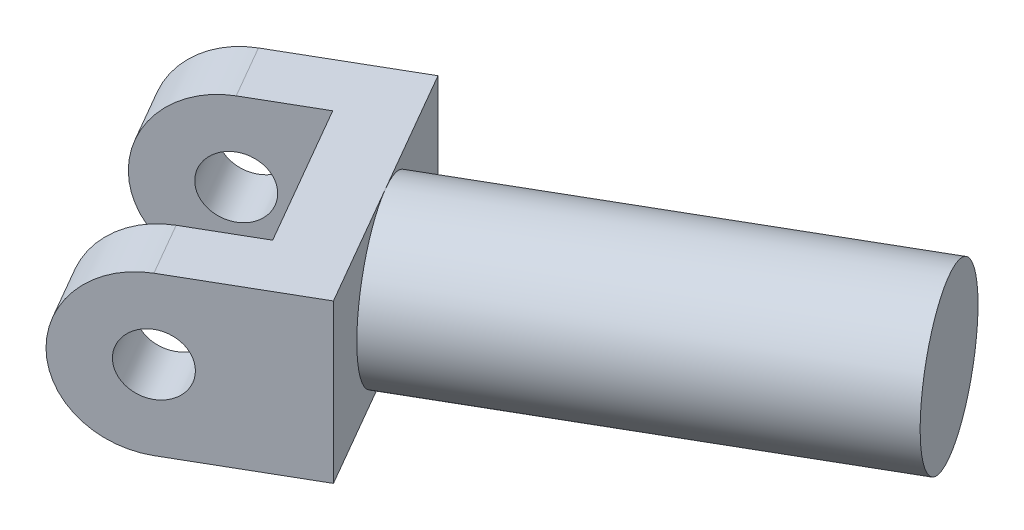
ISO-10303-21;
HEADER;
FILE_DESCRIPTION(('STEP AP214'),'2;1');
FILE_NAME('part.step','',(''),(''),'','','');
FILE_SCHEMA(('AUTOMOTIVE_DESIGN { 1 0 10303 214 1 1 1 1 }'));
ENDSEC;
DATA;
#1=APPLICATION_CONTEXT('core data for automotive mechanical design processes');
#2=APPLICATION_PROTOCOL_DEFINITION('international standard','automotive_design',2000,#1);
#3=PRODUCT_CONTEXT('',#1,'mechanical');
#4=PRODUCT('Part','Part','',(#3));
#5=PRODUCT_RELATED_PRODUCT_CATEGORY('part','',(#4));
#6=PRODUCT_DEFINITION_FORMATION('','',#4);
#7=PRODUCT_DEFINITION_CONTEXT('part definition',#1,'design');
#8=PRODUCT_DEFINITION('design','',#6,#7);
#9=PRODUCT_DEFINITION_SHAPE('','',#8);
#10=(LENGTH_UNIT() NAMED_UNIT(*) SI_UNIT(.MILLI.,.METRE.));
#11=(NAMED_UNIT(*) PLANE_ANGLE_UNIT() SI_UNIT($,.RADIAN.));
#12=(NAMED_UNIT(*) SI_UNIT($,.STERADIAN.) SOLID_ANGLE_UNIT());
#13=UNCERTAINTY_MEASURE_WITH_UNIT(LENGTH_MEASURE(1.E-05),#10,'distance_accuracy_value','');
#14=(GEOMETRIC_REPRESENTATION_CONTEXT(3) GLOBAL_UNCERTAINTY_ASSIGNED_CONTEXT((#13)) GLOBAL_UNIT_ASSIGNED_CONTEXT((#10,
#11,#12)) REPRESENTATION_CONTEXT('',''));
#15=CARTESIAN_POINT('',(0.,0.,0.));
#16=DIRECTION('',(0.,0.,1.));
#17=DIRECTION('',(1.,0.,0.));
#18=AXIS2_PLACEMENT_3D('',#15,#16,#17);
#19=CARTESIAN_POINT('',(-6.75000000000001,0.,-11.6913429510899));
#20=DIRECTION('',(-0.5,0.,-0.866025403784439));
#21=DIRECTION('',(0.866025403784439,0.,-0.5));
#22=AXIS2_PLACEMENT_3D('',#19,#20,#21);
#23=PLANE('',#22);
#24=CARTESIAN_POINT('',(-6.75000000000001,0.,-11.6913429510899));
#25=DIRECTION('',(-0.5,0.,-0.866025403784439));
#26=DIRECTION('',(0.866025403784439,0.,-0.5));
#27=AXIS2_PLACEMENT_3D('',#24,#25,#26);
#28=CIRCLE('',#27,5.);
#29=CARTESIAN_POINT('',(-2.41987298107782,0.,-14.1913429510899));
#30=VERTEX_POINT('',#29);
#31=EDGE_CURVE('E169',#30,#30,#28,.T.);
#32=ORIENTED_EDGE('',*,*,#31,.T.);
#33=EDGE_LOOP('',(#32));
#34=FACE_BOUND('',#33,.T.);
#35=DIRECTION('',(0.,-1.,0.));
#36=VECTOR('',#35,1.);
#37=CARTESIAN_POINT('',(3.31863148873325,0.,-17.5044700514812));
#38=LINE('',#37,#36);
#39=CARTESIAN_POINT('',(3.31863148873325,13.,-17.5044700514812));
#40=VERTEX_POINT('',#39);
#41=CARTESIAN_POINT('',(3.31863148873324,-13.,-17.5044700514812));
#42=VERTEX_POINT('',#41);
#43=EDGE_CURVE('E52',#40,#42,#38,.T.);
#44=ORIENTED_EDGE('',*,*,#43,.F.);
#45=DIRECTION('',(0.866025403784439,0.,-0.5));
#46=VECTOR('',#45,1.);
#47=CARTESIAN_POINT('',(-6.75000000000001,13.,-11.6913429510899));
#48=LINE('',#47,#46);
#49=CARTESIAN_POINT('',(-6.75000000000001,13.,-11.6913429510899));
#50=VERTEX_POINT('',#49);
#51=EDGE_CURVE('E185',#50,#40,#48,.T.);
#52=ORIENTED_EDGE('',*,*,#51,.F.);
#53=CARTESIAN_POINT('',(-6.75000000000001,0.,-11.6913429510899));
#54=DIRECTION('',(-0.5,0.,-0.866025403784439));
#55=DIRECTION('',(0.866025403784439,0.,-0.5));
#56=AXIS2_PLACEMENT_3D('',#53,#54,#55);
#57=CIRCLE('',#56,13.);
#58=CARTESIAN_POINT('',(-6.75000000000001,-13.,-11.6913429510899));
#59=VERTEX_POINT('',#58);
#60=EDGE_CURVE('E173',#59,#50,#57,.T.);
#61=ORIENTED_EDGE('',*,*,#60,.F.);
#62=DIRECTION('',(-0.866025403784439,0.,0.5));
#63=VECTOR('',#62,1.);
#64=CARTESIAN_POINT('',(-6.75000000000001,-13.,-11.6913429510899));
#65=LINE('',#64,#63);
#66=EDGE_CURVE('E74',#42,#59,#65,.T.);
#67=ORIENTED_EDGE('',*,*,#66,.F.);
#68=EDGE_LOOP('',(#44,#52,#61,#67));
#69=FACE_BOUND('',#68,.T.);
#70=ADVANCED_FACE('F37',(#34,#69),#23,.F.);
#71=CARTESIAN_POINT('',(-11.75,0.,-20.3515969889343));
#72=DIRECTION('',(-0.5,0.,-0.866025403784439));
#73=DIRECTION('',(0.866025403784439,0.,-0.5));
#74=AXIS2_PLACEMENT_3D('',#71,#72,#73);
#75=PLANE('',#74);
#76=DIRECTION('',(0.866025403784439,0.,-0.5));
#77=VECTOR('',#76,1.);
#78=CARTESIAN_POINT('',(-11.75,13.,-20.3515969889343));
#79=LINE('',#78,#77);
#80=CARTESIAN_POINT('',(-11.75,13.,-20.3515969889343));
#81=VERTEX_POINT('',#80);
#82=CARTESIAN_POINT('',(6.97888552657763,13.,-31.1647240893256));
#83=VERTEX_POINT('',#82);
#84=EDGE_CURVE('E81',#81,#83,#79,.T.);
#85=ORIENTED_EDGE('',*,*,#84,.T.);
#86=DIRECTION('',(0.,-1.,0.));
#87=VECTOR('',#86,1.);
#88=CARTESIAN_POINT('',(6.97888552657763,-13.,-31.1647240893256));
#89=LINE('',#88,#87);
#90=CARTESIAN_POINT('',(6.97888552657763,-13.,-31.1647240893256));
#91=VERTEX_POINT('',#90);
#92=EDGE_CURVE('E179',#83,#91,#89,.T.);
#93=ORIENTED_EDGE('',*,*,#92,.T.);
#94=DIRECTION('',(-0.866025403784439,0.,0.5));
#95=VECTOR('',#94,1.);
#96=CARTESIAN_POINT('',(-11.75,-13.,-20.3515969889343));
#97=LINE('',#96,#95);
#98=CARTESIAN_POINT('',(-11.75,-13.,-20.3515969889343));
#99=VERTEX_POINT('',#98);
#100=EDGE_CURVE('E61',#91,#99,#97,.T.);
#101=ORIENTED_EDGE('',*,*,#100,.T.);
#102=CARTESIAN_POINT('',(-11.75,0.,-20.3515969889343));
#103=DIRECTION('',(-0.5,0.,-0.866025403784439));
#104=DIRECTION('',(0.866025403784439,0.,-0.5));
#105=AXIS2_PLACEMENT_3D('',#102,#103,#104);
#106=CIRCLE('',#105,13.);
#107=EDGE_CURVE('E176',#99,#81,#106,.T.);
#108=ORIENTED_EDGE('',*,*,#107,.T.);
#109=EDGE_LOOP('',(#85,#93,#101,#108));
#110=FACE_BOUND('',#109,.T.);
#111=CARTESIAN_POINT('',(-11.75,0.,-20.3515969889343));
#112=DIRECTION('',(-0.5,0.,-0.866025403784439));
#113=DIRECTION('',(0.866025403784439,0.,-0.5));
#114=AXIS2_PLACEMENT_3D('',#111,#112,#113);
#115=CIRCLE('',#114,5.);
#116=CARTESIAN_POINT('',(-7.41987298107782,0.,-22.8515969889343));
#117=VERTEX_POINT('',#116);
#118=EDGE_CURVE('E170',#117,#117,#115,.T.);
#119=ORIENTED_EDGE('',*,*,#118,.F.);
#120=EDGE_LOOP('',(#119));
#121=FACE_BOUND('',#120,.T.);
#122=ADVANCED_FACE('F217',(#110,#121),#75,.T.);
#123=CARTESIAN_POINT('',(-11.75,0.,-20.3515969889343));
#124=DIRECTION('',(0.5,0.,0.866025403784439));
#125=DIRECTION('',(-0.866025403784439,0.,0.5));
#126=AXIS2_PLACEMENT_3D('',#123,#124,#125);
#127=CYLINDRICAL_SURFACE('',#126,13.);
#128=ORIENTED_EDGE('',*,*,#60,.T.);
#129=DIRECTION('',(0.5,0.,0.866025403784439));
#130=VECTOR('',#129,1.);
#131=CARTESIAN_POINT('',(-11.75,13.,-20.3515969889343));
#132=LINE('',#131,#130);
#133=EDGE_CURVE('E12',#81,#50,#132,.T.);
#134=ORIENTED_EDGE('',*,*,#133,.F.);
#135=ORIENTED_EDGE('',*,*,#107,.F.);
#136=DIRECTION('',(0.5,0.,0.866025403784439));
#137=VECTOR('',#136,1.);
#138=CARTESIAN_POINT('',(-11.75,-13.,-20.3515969889343));
#139=LINE('',#138,#137);
#140=EDGE_CURVE('E182',#99,#59,#139,.T.);
#141=ORIENTED_EDGE('',*,*,#140,.T.);
#142=EDGE_LOOP('',(#128,#134,#135,#141));
#143=FACE_BOUND('',#142,.T.);
#144=ADVANCED_FACE('F39',(#143),#127,.T.);
#145=CARTESIAN_POINT('',(-11.75,13.,-20.3515969889343));
#146=DIRECTION('',(0.,-1.,0.));
#147=DIRECTION('',(-0.5,0.,0.866025403784439));
#148=AXIS2_PLACEMENT_3D('',#145,#146,#147);
#149=PLANE('',#148);
#150=DIRECTION('',(0.5,0.,0.866025403784439));
#151=VECTOR('',#150,1.);
#152=CARTESIAN_POINT('',(6.97888552657763,13.,-31.1647240893256));
#153=LINE('',#152,#151);
#154=CARTESIAN_POINT('',(18.7288855265777,13.,-10.8131271003913));
#155=VERTEX_POINT('',#154);
#156=EDGE_CURVE('E45',#83,#155,#153,.T.);
#157=ORIENTED_EDGE('',*,*,#156,.F.);
#158=ORIENTED_EDGE('',*,*,#84,.F.);
#159=ORIENTED_EDGE('',*,*,#133,.T.);
#160=ORIENTED_EDGE('',*,*,#51,.T.);
#161=DIRECTION('',(0.5,0.,0.866025403784438));
#162=VECTOR('',#161,1.);
#163=CARTESIAN_POINT('',(21.8186314887333,13.,14.538469888543));
#164=LINE('',#163,#162);
#165=CARTESIAN_POINT('',(16.8186314887333,13.,5.87821585069863));
#166=VERTEX_POINT('',#165);
#167=EDGE_CURVE('E128',#40,#166,#164,.T.);
#168=ORIENTED_EDGE('',*,*,#167,.T.);
#169=DIRECTION('',(-0.866025403784438,0.,0.5));
#170=VECTOR('',#169,1.);
#171=CARTESIAN_POINT('',(6.75,13.,11.6913429510899));
#172=LINE('',#171,#170);
#173=CARTESIAN_POINT('',(6.75,13.,11.6913429510899));
#174=VERTEX_POINT('',#173);
#175=EDGE_CURVE('E139',#166,#174,#172,.T.);
#176=ORIENTED_EDGE('',*,*,#175,.T.);
#177=DIRECTION('',(-0.5,0.,-0.866025403784438));
#178=VECTOR('',#177,1.);
#179=CARTESIAN_POINT('',(11.75,13.,20.3515969889343));
#180=LINE('',#179,#178);
#181=CARTESIAN_POINT('',(11.75,13.,20.3515969889343));
#182=VERTEX_POINT('',#181);
#183=EDGE_CURVE('E138',#182,#174,#180,.T.);
#184=ORIENTED_EDGE('',*,*,#183,.F.);
#185=DIRECTION('',(0.866025403784438,0.,-0.5));
#186=VECTOR('',#185,1.);
#187=CARTESIAN_POINT('',(21.8186314887333,13.,14.538469888543));
#188=LINE('',#187,#186);
#189=CARTESIAN_POINT('',(30.4788855265776,13.,9.53846988854301));
#190=VERTEX_POINT('',#189);
#191=EDGE_CURVE('E127',#182,#190,#188,.T.);
#192=ORIENTED_EDGE('',*,*,#191,.T.);
#193=DIRECTION('',(0.5,0.,0.866025403784438));
#194=VECTOR('',#193,1.);
#195=CARTESIAN_POINT('',(30.4788855265776,13.,9.53846988854301));
#196=LINE('',#195,#194);
#197=EDGE_CURVE('E159',#155,#190,#196,.T.);
#198=ORIENTED_EDGE('',*,*,#197,.F.);
#199=EDGE_LOOP('',(#157,#158,#159,#160,#168,#176,#184,#192,#198));
#200=FACE_BOUND('',#199,.T.);
#201=ADVANCED_FACE('F197',(#200),#149,.F.);
#202=CARTESIAN_POINT('',(6.97888552657763,-13.,-31.1647240893256));
#203=DIRECTION('',(-0.866025403784439,0.,0.5));
#204=DIRECTION('',(-0.5,0.,-0.866025403784439));
#205=AXIS2_PLACEMENT_3D('',#202,#203,#204);
#206=PLANE('',#205);
#207=ORIENTED_EDGE('',*,*,#156,.T.);
#208=CARTESIAN_POINT('',(18.7288855265777,0.,-10.8131271003913));
#209=DIRECTION('',(0.866025403784438,0.,-0.5));
#210=DIRECTION('',(-0.5,0.,-0.866025403784439));
#211=AXIS2_PLACEMENT_3D('',#208,#209,#210);
#212=CIRCLE('',#211,13.);
#213=CARTESIAN_POINT('',(18.7288855265777,-13.,-10.8131271003913));
#214=VERTEX_POINT('',#213);
#215=EDGE_CURVE('E144',#214,#155,#212,.T.);
#216=ORIENTED_EDGE('',*,*,#215,.F.);
#217=DIRECTION('',(0.5,0.,0.866025403784439));
#218=VECTOR('',#217,1.);
#219=CARTESIAN_POINT('',(6.97888552657763,-13.,-31.1647240893256));
#220=LINE('',#219,#218);
#221=EDGE_CURVE('E189',#91,#214,#220,.T.);
#222=ORIENTED_EDGE('',*,*,#221,.F.);
#223=ORIENTED_EDGE('',*,*,#92,.F.);
#224=EDGE_LOOP('',(#207,#216,#222,#223));
#225=FACE_BOUND('',#224,.T.);
#226=ADVANCED_FACE('F194',(#225),#206,.F.);
#227=CARTESIAN_POINT('',(-11.75,-13.,-20.3515969889343));
#228=DIRECTION('',(0.,1.,0.));
#229=DIRECTION('',(0.5,0.,-0.866025403784439));
#230=AXIS2_PLACEMENT_3D('',#227,#228,#229);
#231=PLANE('',#230);
#232=ORIENTED_EDGE('',*,*,#221,.T.);
#233=DIRECTION('',(-0.5,0.,-0.866025403784438));
#234=VECTOR('',#233,1.);
#235=CARTESIAN_POINT('',(30.4788855265776,-13.,9.53846988854301));
#236=LINE('',#235,#234);
#237=CARTESIAN_POINT('',(30.4788855265776,-13.,9.53846988854301));
#238=VERTEX_POINT('',#237);
#239=EDGE_CURVE('E123',#238,#214,#236,.T.);
#240=ORIENTED_EDGE('',*,*,#239,.F.);
#241=DIRECTION('',(0.866025403784438,0.,-0.5));
#242=VECTOR('',#241,1.);
#243=CARTESIAN_POINT('',(21.8186314887333,-13.,14.538469888543));
#244=LINE('',#243,#242);
#245=CARTESIAN_POINT('',(11.75,-13.,20.3515969889343));
#246=VERTEX_POINT('',#245);
#247=EDGE_CURVE('E115',#246,#238,#244,.T.);
#248=ORIENTED_EDGE('',*,*,#247,.F.);
#249=DIRECTION('',(-0.5,0.,-0.866025403784438));
#250=VECTOR('',#249,1.);
#251=CARTESIAN_POINT('',(11.75,-13.,20.3515969889343));
#252=LINE('',#251,#250);
#253=CARTESIAN_POINT('',(6.75,-13.,11.6913429510899));
#254=VERTEX_POINT('',#253);
#255=EDGE_CURVE('E120',#246,#254,#252,.T.);
#256=ORIENTED_EDGE('',*,*,#255,.T.);
#257=DIRECTION('',(0.866025403784438,0.,-0.5));
#258=VECTOR('',#257,1.);
#259=CARTESIAN_POINT('',(6.75,-13.,11.6913429510899));
#260=LINE('',#259,#258);
#261=CARTESIAN_POINT('',(16.8186314887333,-13.,5.87821585069863));
#262=VERTEX_POINT('',#261);
#263=EDGE_CURVE('E246',#254,#262,#260,.T.);
#264=ORIENTED_EDGE('',*,*,#263,.T.);
#265=DIRECTION('',(-0.5,0.,-0.866025403784438));
#266=VECTOR('',#265,1.);
#267=CARTESIAN_POINT('',(21.8186314887333,-13.,14.538469888543));
#268=LINE('',#267,#266);
#269=EDGE_CURVE('E157',#262,#42,#268,.T.);
#270=ORIENTED_EDGE('',*,*,#269,.T.);
#271=ORIENTED_EDGE('',*,*,#66,.T.);
#272=ORIENTED_EDGE('',*,*,#140,.F.);
#273=ORIENTED_EDGE('',*,*,#100,.F.);
#274=EDGE_LOOP('',(#232,#240,#248,#256,#264,#270,#271,#272,#273));
#275=FACE_BOUND('',#274,.T.);
#276=ADVANCED_FACE('F117',(#275),#231,.F.);
#277=CARTESIAN_POINT('',(-11.75,0.,-20.3515969889343));
#278=DIRECTION('',(0.5,0.,0.866025403784439));
#279=DIRECTION('',(-0.866025403784439,0.,0.5));
#280=AXIS2_PLACEMENT_3D('',#277,#278,#279);
#281=CYLINDRICAL_SURFACE('',#280,5.);
#282=ORIENTED_EDGE('',*,*,#118,.T.);
#283=EDGE_LOOP('',(#282));
#284=FACE_BOUND('',#283,.T.);
#285=ORIENTED_EDGE('',*,*,#31,.F.);
#286=EDGE_LOOP('',(#285));
#287=FACE_BOUND('',#286,.T.);
#288=ADVANCED_FACE('F228',(#284,#287),#281,.F.);
#289=CARTESIAN_POINT('',(10.0686314887333,0.,-5.81312710039129));
#290=DIRECTION('',(0.866025403784438,0.,-0.5));
#291=DIRECTION('',(-0.5,0.,-0.866025403784438));
#292=AXIS2_PLACEMENT_3D('',#289,#290,#291);
#293=PLANE('',#292);
#294=ORIENTED_EDGE('',*,*,#167,.F.);
#295=ORIENTED_EDGE('',*,*,#43,.T.);
#296=ORIENTED_EDGE('',*,*,#269,.F.);
#297=DIRECTION('',(0.,-1.,0.));
#298=VECTOR('',#297,1.);
#299=CARTESIAN_POINT('',(16.8186314887333,0.,5.87821585069863));
#300=LINE('',#299,#298);
#301=EDGE_CURVE('E164',#166,#262,#300,.T.);
#302=ORIENTED_EDGE('',*,*,#301,.F.);
#303=EDGE_LOOP('',(#294,#295,#296,#302));
#304=FACE_BOUND('',#303,.T.);
#305=ADVANCED_FACE('F243',(#304),#293,.F.);
#306=CARTESIAN_POINT('',(18.7288855265776,0.,-10.8131271003913));
#307=DIRECTION('',(0.866025403784438,0.,-0.5));
#308=DIRECTION('',(-0.5,0.,-0.866025403784438));
#309=AXIS2_PLACEMENT_3D('',#306,#307,#308);
#310=PLANE('',#309);
#311=ORIENTED_EDGE('',*,*,#197,.T.);
#312=DIRECTION('',(0.,-1.,0.));
#313=VECTOR('',#312,1.);
#314=CARTESIAN_POINT('',(30.4788855265776,13.,9.53846988854301));
#315=LINE('',#314,#313);
#316=EDGE_CURVE('E154',#190,#238,#315,.T.);
#317=ORIENTED_EDGE('',*,*,#316,.T.);
#318=ORIENTED_EDGE('',*,*,#239,.T.);
#319=EDGE_CURVE('E147',#155,#214,#212,.T.);
#320=ORIENTED_EDGE('',*,*,#319,.F.);
#321=EDGE_LOOP('',(#311,#317,#318,#320));
#322=FACE_BOUND('',#321,.T.);
#323=ADVANCED_FACE('F199',(#322),#310,.T.);
#324=CARTESIAN_POINT('',(21.8186314887333,13.,14.538469888543));
#325=DIRECTION('',(0.5,0.,0.866025403784438));
#326=DIRECTION('',(0.866025403784438,0.,-0.5));
#327=AXIS2_PLACEMENT_3D('',#324,#325,#326);
#328=PLANE('',#327);
#329=ORIENTED_EDGE('',*,*,#316,.F.);
#330=ORIENTED_EDGE('',*,*,#191,.F.);
#331=CARTESIAN_POINT('',(11.75,0.,20.3515969889343));
#332=DIRECTION('',(0.5,0.,0.866025403784438));
#333=DIRECTION('',(0.866025403784439,0.,-0.5));
#334=AXIS2_PLACEMENT_3D('',#331,#332,#333);
#335=CIRCLE('',#334,13.);
#336=EDGE_CURVE('E131',#182,#246,#335,.T.);
#337=ORIENTED_EDGE('',*,*,#336,.T.);
#338=ORIENTED_EDGE('',*,*,#247,.T.);
#339=EDGE_LOOP('',(#329,#330,#337,#338));
#340=FACE_BOUND('',#339,.T.);
#341=CARTESIAN_POINT('',(11.75,0.,20.3515969889343));
#342=DIRECTION('',(0.5,0.,0.866025403784438));
#343=DIRECTION('',(0.866025403784439,0.,-0.5));
#344=AXIS2_PLACEMENT_3D('',#341,#342,#343);
#345=CIRCLE('',#344,5.);
#346=CARTESIAN_POINT('',(16.0801270189222,0.,17.8515969889343));
#347=VERTEX_POINT('',#346);
#348=EDGE_CURVE('E249',#347,#347,#345,.T.);
#349=ORIENTED_EDGE('',*,*,#348,.F.);
#350=EDGE_LOOP('',(#349));
#351=FACE_BOUND('',#350,.T.);
#352=ADVANCED_FACE('F132',(#340,#351),#328,.T.);
#353=CARTESIAN_POINT('',(77.4997864783109,0.,-44.7445225853913));
#354=DIRECTION('',(-0.866025403784438,0.,0.5));
#355=DIRECTION('',(0.5,0.,0.866025403784439));
#356=AXIS2_PLACEMENT_3D('',#353,#354,#355);
#357=CYLINDRICAL_SURFACE('',#356,13.);
#358=CARTESIAN_POINT('',(77.4997864783109,0.,-44.7445225853913));
#359=DIRECTION('',(0.866025403784438,0.,-0.5));
#360=DIRECTION('',(-0.5,0.,-0.866025403784439));
#361=AXIS2_PLACEMENT_3D('',#358,#359,#360);
#362=CIRCLE('',#361,13.);
#363=CARTESIAN_POINT('',(70.9997864783109,0.,-56.002852834589));
#364=VERTEX_POINT('',#363);
#365=EDGE_CURVE('E152',#364,#364,#362,.T.);
#366=ORIENTED_EDGE('',*,*,#365,.F.);
#367=EDGE_LOOP('',(#366));
#368=FACE_BOUND('',#367,.T.);
#369=ORIENTED_EDGE('',*,*,#319,.T.);
#370=ORIENTED_EDGE('',*,*,#215,.T.);
#371=EDGE_LOOP('',(#369,#370));
#372=FACE_BOUND('',#371,.T.);
#373=ADVANCED_FACE('F201',(#368,#372),#357,.T.);
#374=CARTESIAN_POINT('',(77.4997864783109,0.,-44.7445225853913));
#375=DIRECTION('',(0.866025403784438,0.,-0.5));
#376=DIRECTION('',(-0.5,0.,-0.866025403784439));
#377=AXIS2_PLACEMENT_3D('',#374,#375,#376);
#378=PLANE('',#377);
#379=ORIENTED_EDGE('',*,*,#365,.T.);
#380=EDGE_LOOP('',(#379));
#381=FACE_BOUND('',#380,.T.);
#382=ADVANCED_FACE('F203',(#381),#378,.T.);
#383=CARTESIAN_POINT('',(6.75,0.,11.6913429510899));
#384=DIRECTION('',(0.5,0.,0.866025403784438));
#385=DIRECTION('',(0.866025403784439,0.,-0.5));
#386=AXIS2_PLACEMENT_3D('',#383,#384,#385);
#387=PLANE('',#386);
#388=CARTESIAN_POINT('',(6.75,0.,11.6913429510899));
#389=DIRECTION('',(0.5,0.,0.866025403784438));
#390=DIRECTION('',(0.866025403784439,0.,-0.5));
#391=AXIS2_PLACEMENT_3D('',#388,#389,#390);
#392=CIRCLE('',#391,5.);
#393=CARTESIAN_POINT('',(11.0801270189222,0.,9.19134295108993));
#394=VERTEX_POINT('',#393);
#395=EDGE_CURVE('E251',#394,#394,#392,.T.);
#396=ORIENTED_EDGE('',*,*,#395,.T.);
#397=EDGE_LOOP('',(#396));
#398=FACE_BOUND('',#397,.T.);
#399=ORIENTED_EDGE('',*,*,#175,.F.);
#400=ORIENTED_EDGE('',*,*,#301,.T.);
#401=ORIENTED_EDGE('',*,*,#263,.F.);
#402=CARTESIAN_POINT('',(6.75,0.,11.6913429510899));
#403=DIRECTION('',(0.5,0.,0.866025403784438));
#404=DIRECTION('',(0.866025403784439,0.,-0.5));
#405=AXIS2_PLACEMENT_3D('',#402,#403,#404);
#406=CIRCLE('',#405,13.);
#407=EDGE_CURVE('E143',#174,#254,#406,.T.);
#408=ORIENTED_EDGE('',*,*,#407,.F.);
#409=EDGE_LOOP('',(#399,#400,#401,#408));
#410=FACE_BOUND('',#409,.T.);
#411=ADVANCED_FACE('F210',(#398,#410),#387,.F.);
#412=CARTESIAN_POINT('',(11.75,0.,20.3515969889343));
#413=DIRECTION('',(-0.5,0.,-0.866025403784438));
#414=DIRECTION('',(-0.866025403784438,0.,0.5));
#415=AXIS2_PLACEMENT_3D('',#412,#413,#414);
#416=CYLINDRICAL_SURFACE('',#415,13.);
#417=ORIENTED_EDGE('',*,*,#407,.T.);
#418=ORIENTED_EDGE('',*,*,#255,.F.);
#419=ORIENTED_EDGE('',*,*,#336,.F.);
#420=ORIENTED_EDGE('',*,*,#183,.T.);
#421=EDGE_LOOP('',(#417,#418,#419,#420));
#422=FACE_BOUND('',#421,.T.);
#423=ADVANCED_FACE('F141',(#422),#416,.T.);
#424=CARTESIAN_POINT('',(11.75,0.,20.3515969889343));
#425=DIRECTION('',(-0.5,0.,-0.866025403784438));
#426=DIRECTION('',(-0.866025403784438,0.,0.5));
#427=AXIS2_PLACEMENT_3D('',#424,#425,#426);
#428=CYLINDRICAL_SURFACE('',#427,5.);
#429=ORIENTED_EDGE('',*,*,#348,.T.);
#430=EDGE_LOOP('',(#429));
#431=FACE_BOUND('',#430,.T.);
#432=ORIENTED_EDGE('',*,*,#395,.F.);
#433=EDGE_LOOP('',(#432));
#434=FACE_BOUND('',#433,.T.);
#435=ADVANCED_FACE('F257',(#431,#434),#428,.F.);
#436=CLOSED_SHELL('',(#70,#122,#144,#201,#226,#276,#288,#305,#323,#352,#373,#382,#411,#423,#435));
#437=MANIFOLD_SOLID_BREP('B2',#436);
#438=ADVANCED_BREP_SHAPE_REPRESENTATION('',(#18,#437),#14);
#439=SHAPE_DEFINITION_REPRESENTATION(#9,#438);
ENDSEC;
END-ISO-10303-21;
